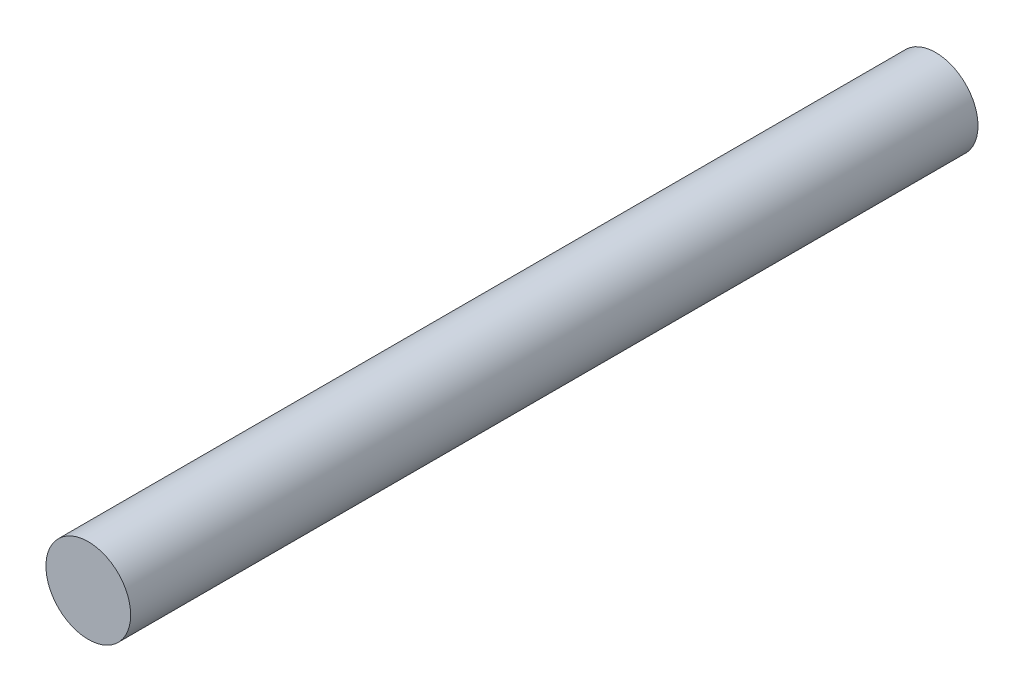
ISO-10303-21;
HEADER;
FILE_DESCRIPTION(('STEP AP214'),'2;1');
FILE_NAME('part.step','',(''),(''),'','','');
FILE_SCHEMA(('AUTOMOTIVE_DESIGN { 1 0 10303 214 1 1 1 1 }'));
ENDSEC;
DATA;
#1=APPLICATION_CONTEXT('core data for automotive mechanical design processes');
#2=APPLICATION_PROTOCOL_DEFINITION('international standard','automotive_design',2000,#1);
#3=PRODUCT_CONTEXT('',#1,'mechanical');
#4=PRODUCT('Part','Part','',(#3));
#5=PRODUCT_RELATED_PRODUCT_CATEGORY('part','',(#4));
#6=PRODUCT_DEFINITION_FORMATION('','',#4);
#7=PRODUCT_DEFINITION_CONTEXT('part definition',#1,'design');
#8=PRODUCT_DEFINITION('design','',#6,#7);
#9=PRODUCT_DEFINITION_SHAPE('','',#8);
#10=(LENGTH_UNIT() NAMED_UNIT(*) SI_UNIT(.MILLI.,.METRE.));
#11=(NAMED_UNIT(*) PLANE_ANGLE_UNIT() SI_UNIT($,.RADIAN.));
#12=(NAMED_UNIT(*) SI_UNIT($,.STERADIAN.) SOLID_ANGLE_UNIT());
#13=UNCERTAINTY_MEASURE_WITH_UNIT(LENGTH_MEASURE(1.E-05),#10,'distance_accuracy_value','');
#14=(GEOMETRIC_REPRESENTATION_CONTEXT(3) GLOBAL_UNCERTAINTY_ASSIGNED_CONTEXT((#13)) GLOBAL_UNIT_ASSIGNED_CONTEXT((#10,
#11,#12)) REPRESENTATION_CONTEXT('',''));
#15=CARTESIAN_POINT('',(0.,0.,0.));
#16=DIRECTION('',(0.,0.,1.));
#17=DIRECTION('',(1.,0.,0.));
#18=AXIS2_PLACEMENT_3D('',#15,#16,#17);
#19=CARTESIAN_POINT('',(0.,0.,100.));
#20=DIRECTION('',(0.,0.,-1.));
#21=DIRECTION('',(-1.,0.,0.));
#22=AXIS2_PLACEMENT_3D('',#19,#20,#21);
#23=CYLINDRICAL_SURFACE('',#22,10.);
#24=CARTESIAN_POINT('',(0.,0.,100.));
#25=DIRECTION('',(0.,0.,1.));
#26=DIRECTION('',(1.,0.,0.));
#27=AXIS2_PLACEMENT_3D('',#24,#25,#26);
#28=CIRCLE('',#27,10.);
#29=CARTESIAN_POINT('',(10.,0.,100.));
#30=VERTEX_POINT('',#29);
#31=EDGE_CURVE('E10',#30,#30,#28,.T.);
#32=ORIENTED_EDGE('',*,*,#31,.F.);
#33=EDGE_LOOP('',(#32));
#34=FACE_BOUND('',#33,.T.);
#35=CARTESIAN_POINT('',(0.,0.,-100.));
#36=DIRECTION('',(0.,0.,1.));
#37=DIRECTION('',(1.,0.,0.));
#38=AXIS2_PLACEMENT_3D('',#35,#36,#37);
#39=CIRCLE('',#38,10.);
#40=CARTESIAN_POINT('',(10.,0.,-100.));
#41=VERTEX_POINT('',#40);
#42=EDGE_CURVE('E44',#41,#41,#39,.T.);
#43=ORIENTED_EDGE('',*,*,#42,.T.);
#44=EDGE_LOOP('',(#43));
#45=FACE_BOUND('',#44,.T.);
#46=ADVANCED_FACE('F41',(#34,#45),#23,.T.);
#47=CARTESIAN_POINT('',(0.,0.,100.));
#48=DIRECTION('',(0.,0.,1.));
#49=DIRECTION('',(1.,0.,0.));
#50=AXIS2_PLACEMENT_3D('',#47,#48,#49);
#51=PLANE('',#50);
#52=ORIENTED_EDGE('',*,*,#31,.T.);
#53=EDGE_LOOP('',(#52));
#54=FACE_BOUND('',#53,.T.);
#55=ADVANCED_FACE('F58',(#54),#51,.T.);
#56=CARTESIAN_POINT('',(0.,0.,-100.));
#57=DIRECTION('',(0.,0.,1.));
#58=DIRECTION('',(1.,0.,0.));
#59=AXIS2_PLACEMENT_3D('',#56,#57,#58);
#60=PLANE('',#59);
#61=ORIENTED_EDGE('',*,*,#42,.F.);
#62=EDGE_LOOP('',(#61));
#63=FACE_BOUND('',#62,.T.);
#64=ADVANCED_FACE('F56',(#63),#60,.F.);
#65=CLOSED_SHELL('',(#46,#55,#64));
#66=MANIFOLD_SOLID_BREP('B2',#65);
#67=ADVANCED_BREP_SHAPE_REPRESENTATION('',(#18,#66),#14);
#68=SHAPE_DEFINITION_REPRESENTATION(#9,#67);
ENDSEC;
END-ISO-10303-21;
